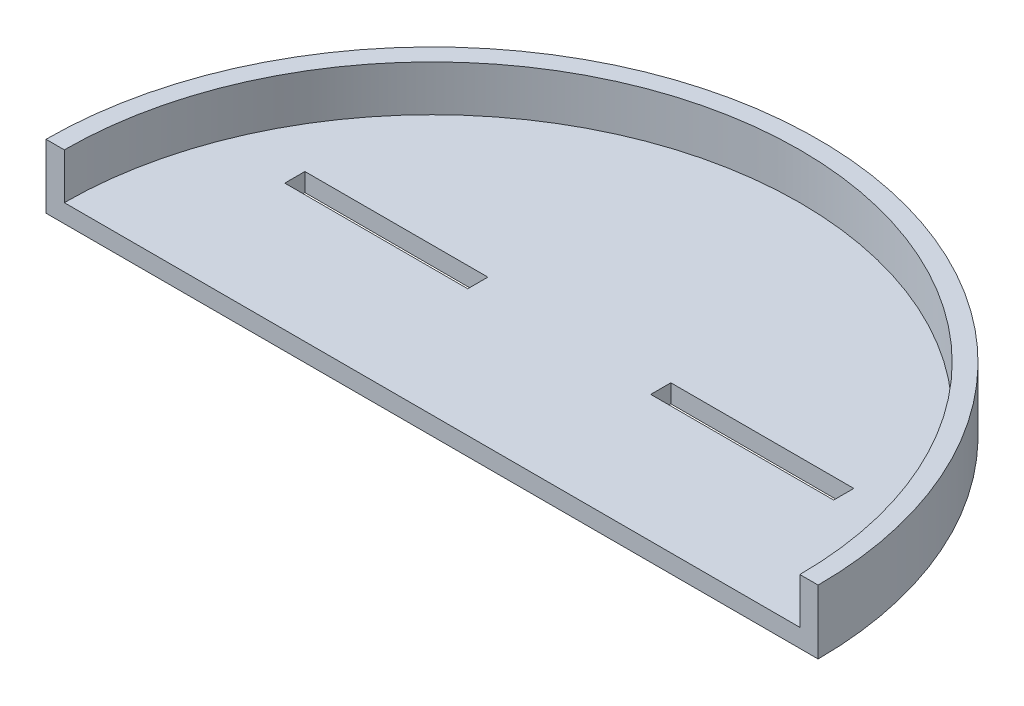
ISO-10303-21;
HEADER;
FILE_DESCRIPTION(('STEP AP214'),'2;1');
FILE_NAME('part.step','',(''),(''),'','','');
FILE_SCHEMA(('AUTOMOTIVE_DESIGN { 1 0 10303 214 1 1 1 1 }'));
ENDSEC;
DATA;
#1=APPLICATION_CONTEXT('core data for automotive mechanical design processes');
#2=APPLICATION_PROTOCOL_DEFINITION('international standard','automotive_design',2000,#1);
#3=PRODUCT_CONTEXT('',#1,'mechanical');
#4=PRODUCT('Part','Part','',(#3));
#5=PRODUCT_RELATED_PRODUCT_CATEGORY('part','',(#4));
#6=PRODUCT_DEFINITION_FORMATION('','',#4);
#7=PRODUCT_DEFINITION_CONTEXT('part definition',#1,'design');
#8=PRODUCT_DEFINITION('design','',#6,#7);
#9=PRODUCT_DEFINITION_SHAPE('','',#8);
#10=(LENGTH_UNIT() NAMED_UNIT(*) SI_UNIT(.MILLI.,.METRE.));
#11=(NAMED_UNIT(*) PLANE_ANGLE_UNIT() SI_UNIT($,.RADIAN.));
#12=(NAMED_UNIT(*) SI_UNIT($,.STERADIAN.) SOLID_ANGLE_UNIT());
#13=UNCERTAINTY_MEASURE_WITH_UNIT(LENGTH_MEASURE(1.E-05),#10,'distance_accuracy_value','');
#14=(GEOMETRIC_REPRESENTATION_CONTEXT(3) GLOBAL_UNCERTAINTY_ASSIGNED_CONTEXT((#13)) GLOBAL_UNIT_ASSIGNED_CONTEXT((#10,
#11,#12)) REPRESENTATION_CONTEXT('',''));
#15=CARTESIAN_POINT('',(0.,0.,0.));
#16=DIRECTION('',(0.,0.,1.));
#17=DIRECTION('',(1.,0.,0.));
#18=AXIS2_PLACEMENT_3D('',#15,#16,#17);
#19=CARTESIAN_POINT('',(0.,0.,0.));
#20=DIRECTION('',(0.,-1.,0.));
#21=DIRECTION('',(0.,0.,-1.));
#22=AXIS2_PLACEMENT_3D('',#19,#20,#21);
#23=PLANE('',#22);
#24=DIRECTION('',(1.,0.,0.));
#25=VECTOR('',#24,1.);
#26=CARTESIAN_POINT('',(0.,0.,-20.447));
#27=LINE('',#26,#25);
#28=CARTESIAN_POINT('',(12.7,0.,-20.447));
#29=VERTEX_POINT('',#28);
#30=CARTESIAN_POINT('',(38.1,0.,-20.447));
#31=VERTEX_POINT('',#30);
#32=EDGE_CURVE('E177',#29,#31,#27,.T.);
#33=ORIENTED_EDGE('',*,*,#32,.T.);
#34=DIRECTION('',(0.,0.,1.));
#35=VECTOR('',#34,1.);
#36=CARTESIAN_POINT('',(38.1,0.,0.));
#37=LINE('',#36,#35);
#38=CARTESIAN_POINT('',(38.1,0.,-17.653));
#39=VERTEX_POINT('',#38);
#40=EDGE_CURVE('E167',#31,#39,#37,.T.);
#41=ORIENTED_EDGE('',*,*,#40,.T.);
#42=DIRECTION('',(1.,0.,0.));
#43=VECTOR('',#42,1.);
#44=CARTESIAN_POINT('',(0.,0.,-17.653));
#45=LINE('',#44,#43);
#46=CARTESIAN_POINT('',(12.7,0.,-17.653));
#47=VERTEX_POINT('',#46);
#48=EDGE_CURVE('E171',#47,#39,#45,.T.);
#49=ORIENTED_EDGE('',*,*,#48,.F.);
#50=DIRECTION('',(0.,0.,1.));
#51=VECTOR('',#50,1.);
#52=CARTESIAN_POINT('',(12.7,0.,0.));
#53=LINE('',#52,#51);
#54=EDGE_CURVE('E174',#29,#47,#53,.T.);
#55=ORIENTED_EDGE('',*,*,#54,.F.);
#56=EDGE_LOOP('',(#33,#41,#49,#55));
#57=FACE_BOUND('',#56,.T.);
#58=CARTESIAN_POINT('',(0.,0.,0.));
#59=DIRECTION('',(0.,1.,0.));
#60=DIRECTION('',(0.,0.,1.));
#61=AXIS2_PLACEMENT_3D('',#58,#59,#60);
#62=CIRCLE('',#61,51.054);
#63=CARTESIAN_POINT('',(51.054,0.,0.));
#64=VERTEX_POINT('',#63);
#65=CARTESIAN_POINT('',(-51.054,0.,0.));
#66=VERTEX_POINT('',#65);
#67=EDGE_CURVE('E149',#64,#66,#62,.T.);
#68=ORIENTED_EDGE('',*,*,#67,.T.);
#69=DIRECTION('',(1.,0.,0.));
#70=VECTOR('',#69,1.);
#71=CARTESIAN_POINT('',(0.,0.,0.));
#72=LINE('',#71,#70);
#73=EDGE_CURVE('E52',#66,#64,#72,.T.);
#74=ORIENTED_EDGE('',*,*,#73,.T.);
#75=EDGE_LOOP('',(#68,#74));
#76=FACE_BOUND('',#75,.T.);
#77=DIRECTION('',(1.,0.,0.));
#78=VECTOR('',#77,1.);
#79=CARTESIAN_POINT('',(0.,0.,-20.447));
#80=LINE('',#79,#78);
#81=CARTESIAN_POINT('',(-38.1,0.,-20.447));
#82=VERTEX_POINT('',#81);
#83=CARTESIAN_POINT('',(-12.7,0.,-20.447));
#84=VERTEX_POINT('',#83);
#85=EDGE_CURVE('E60',#82,#84,#80,.T.);
#86=ORIENTED_EDGE('',*,*,#85,.T.);
#87=DIRECTION('',(0.,0.,1.));
#88=VECTOR('',#87,1.);
#89=CARTESIAN_POINT('',(-12.7,0.,0.));
#90=LINE('',#89,#88);
#91=CARTESIAN_POINT('',(-12.7,0.,-17.653));
#92=VERTEX_POINT('',#91);
#93=EDGE_CURVE('E196',#84,#92,#90,.T.);
#94=ORIENTED_EDGE('',*,*,#93,.T.);
#95=DIRECTION('',(1.,0.,0.));
#96=VECTOR('',#95,1.);
#97=CARTESIAN_POINT('',(0.,0.,-17.653));
#98=LINE('',#97,#96);
#99=CARTESIAN_POINT('',(-38.1,0.,-17.653));
#100=VERTEX_POINT('',#99);
#101=EDGE_CURVE('E200',#100,#92,#98,.T.);
#102=ORIENTED_EDGE('',*,*,#101,.F.);
#103=DIRECTION('',(0.,0.,1.));
#104=VECTOR('',#103,1.);
#105=CARTESIAN_POINT('',(-38.1,0.,0.));
#106=LINE('',#105,#104);
#107=EDGE_CURVE('E203',#82,#100,#106,.T.);
#108=ORIENTED_EDGE('',*,*,#107,.F.);
#109=EDGE_LOOP('',(#86,#94,#102,#108));
#110=FACE_BOUND('',#109,.T.);
#111=ADVANCED_FACE('F38',(#57,#76,#110),#23,.F.);
#112=CARTESIAN_POINT('',(0.,-2.54,0.));
#113=DIRECTION('',(0.,-1.,0.));
#114=DIRECTION('',(0.,0.,-1.));
#115=AXIS2_PLACEMENT_3D('',#112,#113,#114);
#116=PLANE('',#115);
#117=DIRECTION('',(1.,0.,0.));
#118=VECTOR('',#117,1.);
#119=CARTESIAN_POINT('',(0.,-2.54,0.));
#120=LINE('',#119,#118);
#121=CARTESIAN_POINT('',(-53.594,-2.54,0.));
#122=VERTEX_POINT('',#121);
#123=CARTESIAN_POINT('',(53.594,-2.54,0.));
#124=VERTEX_POINT('',#123);
#125=EDGE_CURVE('E217',#122,#124,#120,.T.);
#126=ORIENTED_EDGE('',*,*,#125,.F.);
#127=CARTESIAN_POINT('',(0.,-2.54,0.));
#128=DIRECTION('',(0.,-1.,0.));
#129=DIRECTION('',(0.,0.,-1.));
#130=AXIS2_PLACEMENT_3D('',#127,#128,#129);
#131=CIRCLE('',#130,53.594);
#132=EDGE_CURVE('E142',#122,#124,#131,.T.);
#133=ORIENTED_EDGE('',*,*,#132,.T.);
#134=EDGE_LOOP('',(#126,#133));
#135=FACE_BOUND('',#134,.T.);
#136=DIRECTION('',(0.,0.,1.));
#137=VECTOR('',#136,1.);
#138=CARTESIAN_POINT('',(38.1,-2.54,0.));
#139=LINE('',#138,#137);
#140=CARTESIAN_POINT('',(38.1,-2.54,-20.447));
#141=VERTEX_POINT('',#140);
#142=CARTESIAN_POINT('',(38.1,-2.54,-17.653));
#143=VERTEX_POINT('',#142);
#144=EDGE_CURVE('E160',#141,#143,#139,.T.);
#145=ORIENTED_EDGE('',*,*,#144,.F.);
#146=DIRECTION('',(1.,0.,0.));
#147=VECTOR('',#146,1.);
#148=CARTESIAN_POINT('',(0.,-2.54,-20.447));
#149=LINE('',#148,#147);
#150=CARTESIAN_POINT('',(12.7,-2.54,-20.447));
#151=VERTEX_POINT('',#150);
#152=EDGE_CURVE('E170',#151,#141,#149,.T.);
#153=ORIENTED_EDGE('',*,*,#152,.F.);
#154=DIRECTION('',(0.,0.,1.));
#155=VECTOR('',#154,1.);
#156=CARTESIAN_POINT('',(12.7,-2.54,0.));
#157=LINE('',#156,#155);
#158=CARTESIAN_POINT('',(12.7,-2.54,-17.653));
#159=VERTEX_POINT('',#158);
#160=EDGE_CURVE('E184',#151,#159,#157,.T.);
#161=ORIENTED_EDGE('',*,*,#160,.T.);
#162=DIRECTION('',(1.,0.,0.));
#163=VECTOR('',#162,1.);
#164=CARTESIAN_POINT('',(0.,-2.54,-17.653));
#165=LINE('',#164,#163);
#166=EDGE_CURVE('E181',#159,#143,#165,.T.);
#167=ORIENTED_EDGE('',*,*,#166,.T.);
#168=EDGE_LOOP('',(#145,#153,#161,#167));
#169=FACE_BOUND('',#168,.T.);
#170=DIRECTION('',(0.,0.,1.));
#171=VECTOR('',#170,1.);
#172=CARTESIAN_POINT('',(-12.7,-2.54,0.));
#173=LINE('',#172,#171);
#174=CARTESIAN_POINT('',(-12.7,-2.54,-20.447));
#175=VERTEX_POINT('',#174);
#176=CARTESIAN_POINT('',(-12.7,-2.54,-17.653));
#177=VERTEX_POINT('',#176);
#178=EDGE_CURVE('E191',#175,#177,#173,.T.);
#179=ORIENTED_EDGE('',*,*,#178,.F.);
#180=DIRECTION('',(1.,0.,0.));
#181=VECTOR('',#180,1.);
#182=CARTESIAN_POINT('',(0.,-2.54,-20.447));
#183=LINE('',#182,#181);
#184=CARTESIAN_POINT('',(-38.1,-2.54,-20.447));
#185=VERTEX_POINT('',#184);
#186=EDGE_CURVE('E199',#185,#175,#183,.T.);
#187=ORIENTED_EDGE('',*,*,#186,.F.);
#188=DIRECTION('',(0.,0.,1.));
#189=VECTOR('',#188,1.);
#190=CARTESIAN_POINT('',(-38.1,-2.54,0.));
#191=LINE('',#190,#189);
#192=CARTESIAN_POINT('',(-38.1,-2.54,-17.653));
#193=VERTEX_POINT('',#192);
#194=EDGE_CURVE('E211',#185,#193,#191,.T.);
#195=ORIENTED_EDGE('',*,*,#194,.T.);
#196=DIRECTION('',(1.,0.,0.));
#197=VECTOR('',#196,1.);
#198=CARTESIAN_POINT('',(0.,-2.54,-17.653));
#199=LINE('',#198,#197);
#200=EDGE_CURVE('E208',#193,#177,#199,.T.);
#201=ORIENTED_EDGE('',*,*,#200,.T.);
#202=EDGE_LOOP('',(#179,#187,#195,#201));
#203=FACE_BOUND('',#202,.T.);
#204=ADVANCED_FACE('F219',(#135,#169,#203),#116,.T.);
#205=CARTESIAN_POINT('',(0.,6.35,0.));
#206=DIRECTION('',(0.,1.,0.));
#207=DIRECTION('',(0.,0.,1.));
#208=AXIS2_PLACEMENT_3D('',#205,#206,#207);
#209=PLANE('',#208);
#210=DIRECTION('',(1.,0.,0.));
#211=VECTOR('',#210,1.);
#212=CARTESIAN_POINT('',(0.,6.35,0.));
#213=LINE('',#212,#211);
#214=CARTESIAN_POINT('',(51.054,6.35,0.));
#215=VERTEX_POINT('',#214);
#216=CARTESIAN_POINT('',(53.594,6.35,0.));
#217=VERTEX_POINT('',#216);
#218=EDGE_CURVE('E134',#215,#217,#213,.T.);
#219=ORIENTED_EDGE('',*,*,#218,.T.);
#220=CARTESIAN_POINT('',(0.,6.35,0.));
#221=DIRECTION('',(0.,1.,0.));
#222=DIRECTION('',(0.,0.,1.));
#223=AXIS2_PLACEMENT_3D('',#220,#221,#222);
#224=CIRCLE('',#223,53.594);
#225=CARTESIAN_POINT('',(-53.594,6.35,0.));
#226=VERTEX_POINT('',#225);
#227=EDGE_CURVE('E140',#217,#226,#224,.T.);
#228=ORIENTED_EDGE('',*,*,#227,.T.);
#229=CARTESIAN_POINT('',(-51.054,6.35,0.));
#230=VERTEX_POINT('',#229);
#231=EDGE_CURVE('E125',#226,#230,#213,.T.);
#232=ORIENTED_EDGE('',*,*,#231,.T.);
#233=CARTESIAN_POINT('',(0.,6.35,0.));
#234=DIRECTION('',(0.,1.,0.));
#235=DIRECTION('',(0.,0.,1.));
#236=AXIS2_PLACEMENT_3D('',#233,#234,#235);
#237=CIRCLE('',#236,51.054);
#238=EDGE_CURVE('E147',#215,#230,#237,.T.);
#239=ORIENTED_EDGE('',*,*,#238,.F.);
#240=EDGE_LOOP('',(#219,#228,#232,#239));
#241=FACE_BOUND('',#240,.T.);
#242=ADVANCED_FACE('F146',(#241),#209,.T.);
#243=CARTESIAN_POINT('',(0.,6.35,0.));
#244=DIRECTION('',(0.,-1.,0.));
#245=DIRECTION('',(0.,0.,-1.));
#246=AXIS2_PLACEMENT_3D('',#243,#244,#245);
#247=CYLINDRICAL_SURFACE('',#246,53.594);
#248=ORIENTED_EDGE('',*,*,#227,.F.);
#249=DIRECTION('',(0.,-1.,0.));
#250=VECTOR('',#249,1.);
#251=CARTESIAN_POINT('',(53.594,6.35,0.));
#252=LINE('',#251,#250);
#253=EDGE_CURVE('E143',#217,#124,#252,.T.);
#254=ORIENTED_EDGE('',*,*,#253,.T.);
#255=ORIENTED_EDGE('',*,*,#132,.F.);
#256=DIRECTION('',(0.,-1.,0.));
#257=VECTOR('',#256,1.);
#258=CARTESIAN_POINT('',(-53.594,6.35,0.));
#259=LINE('',#258,#257);
#260=EDGE_CURVE('E128',#122,#226,#259,.F.);
#261=ORIENTED_EDGE('',*,*,#260,.T.);
#262=EDGE_LOOP('',(#248,#254,#255,#261));
#263=FACE_BOUND('',#262,.T.);
#264=ADVANCED_FACE('F40',(#263),#247,.T.);
#265=CARTESIAN_POINT('',(0.,6.35,0.));
#266=DIRECTION('',(0.,-1.,0.));
#267=DIRECTION('',(0.,0.,-1.));
#268=AXIS2_PLACEMENT_3D('',#265,#266,#267);
#269=CYLINDRICAL_SURFACE('',#268,51.054);
#270=DIRECTION('',(0.,-1.,0.));
#271=VECTOR('',#270,1.);
#272=CARTESIAN_POINT('',(51.054,6.35,0.));
#273=LINE('',#272,#271);
#274=EDGE_CURVE('E11',#215,#64,#273,.T.);
#275=ORIENTED_EDGE('',*,*,#274,.F.);
#276=ORIENTED_EDGE('',*,*,#238,.T.);
#277=DIRECTION('',(0.,-1.,0.));
#278=VECTOR('',#277,1.);
#279=CARTESIAN_POINT('',(-51.054,6.35,0.));
#280=LINE('',#279,#278);
#281=EDGE_CURVE('E46',#66,#230,#280,.F.);
#282=ORIENTED_EDGE('',*,*,#281,.F.);
#283=ORIENTED_EDGE('',*,*,#67,.F.);
#284=EDGE_LOOP('',(#275,#276,#282,#283));
#285=FACE_BOUND('',#284,.T.);
#286=ADVANCED_FACE('F259',(#285),#269,.F.);
#287=CARTESIAN_POINT('',(0.,-2.54,-20.447));
#288=DIRECTION('',(0.,0.,1.));
#289=DIRECTION('',(1.,0.,0.));
#290=AXIS2_PLACEMENT_3D('',#287,#288,#289);
#291=PLANE('',#290);
#292=ORIENTED_EDGE('',*,*,#32,.F.);
#293=DIRECTION('',(0.,1.,0.));
#294=VECTOR('',#293,1.);
#295=CARTESIAN_POINT('',(12.7,-2.54,-20.447));
#296=LINE('',#295,#294);
#297=EDGE_CURVE('E156',#151,#29,#296,.T.);
#298=ORIENTED_EDGE('',*,*,#297,.F.);
#299=ORIENTED_EDGE('',*,*,#152,.T.);
#300=DIRECTION('',(0.,1.,0.));
#301=VECTOR('',#300,1.);
#302=CARTESIAN_POINT('',(38.1,-2.54,-20.447));
#303=LINE('',#302,#301);
#304=EDGE_CURVE('E164',#141,#31,#303,.T.);
#305=ORIENTED_EDGE('',*,*,#304,.T.);
#306=EDGE_LOOP('',(#292,#298,#299,#305));
#307=FACE_BOUND('',#306,.T.);
#308=ADVANCED_FACE('F261',(#307),#291,.T.);
#309=CARTESIAN_POINT('',(38.1,-2.54,0.));
#310=DIRECTION('',(-1.,0.,0.));
#311=DIRECTION('',(0.,0.,1.));
#312=AXIS2_PLACEMENT_3D('',#309,#310,#311);
#313=PLANE('',#312);
#314=ORIENTED_EDGE('',*,*,#40,.F.);
#315=ORIENTED_EDGE('',*,*,#304,.F.);
#316=ORIENTED_EDGE('',*,*,#144,.T.);
#317=DIRECTION('',(0.,1.,0.));
#318=VECTOR('',#317,1.);
#319=CARTESIAN_POINT('',(38.1,-2.54,-17.653));
#320=LINE('',#319,#318);
#321=EDGE_CURVE('E162',#143,#39,#320,.T.);
#322=ORIENTED_EDGE('',*,*,#321,.T.);
#323=EDGE_LOOP('',(#314,#315,#316,#322));
#324=FACE_BOUND('',#323,.T.);
#325=ADVANCED_FACE('F333',(#324),#313,.T.);
#326=CARTESIAN_POINT('',(0.,-2.54,-17.653));
#327=DIRECTION('',(0.,0.,1.));
#328=DIRECTION('',(1.,0.,0.));
#329=AXIS2_PLACEMENT_3D('',#326,#327,#328);
#330=PLANE('',#329);
#331=ORIENTED_EDGE('',*,*,#48,.T.);
#332=ORIENTED_EDGE('',*,*,#321,.F.);
#333=ORIENTED_EDGE('',*,*,#166,.F.);
#334=DIRECTION('',(0.,1.,0.));
#335=VECTOR('',#334,1.);
#336=CARTESIAN_POINT('',(12.7,-2.54,-17.653));
#337=LINE('',#336,#335);
#338=EDGE_CURVE('E159',#159,#47,#337,.T.);
#339=ORIENTED_EDGE('',*,*,#338,.T.);
#340=EDGE_LOOP('',(#331,#332,#333,#339));
#341=FACE_BOUND('',#340,.T.);
#342=ADVANCED_FACE('F322',(#341),#330,.F.);
#343=CARTESIAN_POINT('',(12.7,-2.54,0.));
#344=DIRECTION('',(-1.,0.,0.));
#345=DIRECTION('',(0.,0.,1.));
#346=AXIS2_PLACEMENT_3D('',#343,#344,#345);
#347=PLANE('',#346);
#348=ORIENTED_EDGE('',*,*,#54,.T.);
#349=ORIENTED_EDGE('',*,*,#338,.F.);
#350=ORIENTED_EDGE('',*,*,#160,.F.);
#351=ORIENTED_EDGE('',*,*,#297,.T.);
#352=EDGE_LOOP('',(#348,#349,#350,#351));
#353=FACE_BOUND('',#352,.T.);
#354=ADVANCED_FACE('F313',(#353),#347,.F.);
#355=CARTESIAN_POINT('',(0.,-2.54,-20.447));
#356=DIRECTION('',(0.,0.,1.));
#357=DIRECTION('',(1.,0.,0.));
#358=AXIS2_PLACEMENT_3D('',#355,#356,#357);
#359=PLANE('',#358);
#360=ORIENTED_EDGE('',*,*,#85,.F.);
#361=DIRECTION('',(0.,1.,0.));
#362=VECTOR('',#361,1.);
#363=CARTESIAN_POINT('',(-38.1,-2.54,-20.447));
#364=LINE('',#363,#362);
#365=EDGE_CURVE('E188',#185,#82,#364,.T.);
#366=ORIENTED_EDGE('',*,*,#365,.F.);
#367=ORIENTED_EDGE('',*,*,#186,.T.);
#368=DIRECTION('',(0.,1.,0.));
#369=VECTOR('',#368,1.);
#370=CARTESIAN_POINT('',(-12.7,-2.54,-20.447));
#371=LINE('',#370,#369);
#372=EDGE_CURVE('E155',#175,#84,#371,.T.);
#373=ORIENTED_EDGE('',*,*,#372,.T.);
#374=EDGE_LOOP('',(#360,#366,#367,#373));
#375=FACE_BOUND('',#374,.T.);
#376=ADVANCED_FACE('F238',(#375),#359,.T.);
#377=CARTESIAN_POINT('',(-12.7,-2.54,0.));
#378=DIRECTION('',(-1.,0.,0.));
#379=DIRECTION('',(0.,0.,1.));
#380=AXIS2_PLACEMENT_3D('',#377,#378,#379);
#381=PLANE('',#380);
#382=ORIENTED_EDGE('',*,*,#93,.F.);
#383=ORIENTED_EDGE('',*,*,#372,.F.);
#384=ORIENTED_EDGE('',*,*,#178,.T.);
#385=DIRECTION('',(0.,1.,0.));
#386=VECTOR('',#385,1.);
#387=CARTESIAN_POINT('',(-12.7,-2.54,-17.653));
#388=LINE('',#387,#386);
#389=EDGE_CURVE('E193',#177,#92,#388,.T.);
#390=ORIENTED_EDGE('',*,*,#389,.T.);
#391=EDGE_LOOP('',(#382,#383,#384,#390));
#392=FACE_BOUND('',#391,.T.);
#393=ADVANCED_FACE('F231',(#392),#381,.T.);
#394=CARTESIAN_POINT('',(0.,-2.54,-17.653));
#395=DIRECTION('',(0.,0.,1.));
#396=DIRECTION('',(1.,0.,0.));
#397=AXIS2_PLACEMENT_3D('',#394,#395,#396);
#398=PLANE('',#397);
#399=ORIENTED_EDGE('',*,*,#101,.T.);
#400=ORIENTED_EDGE('',*,*,#389,.F.);
#401=ORIENTED_EDGE('',*,*,#200,.F.);
#402=DIRECTION('',(0.,1.,0.));
#403=VECTOR('',#402,1.);
#404=CARTESIAN_POINT('',(-38.1,-2.54,-17.653));
#405=LINE('',#404,#403);
#406=EDGE_CURVE('E190',#193,#100,#405,.T.);
#407=ORIENTED_EDGE('',*,*,#406,.T.);
#408=EDGE_LOOP('',(#399,#400,#401,#407));
#409=FACE_BOUND('',#408,.T.);
#410=ADVANCED_FACE('F233',(#409),#398,.F.);
#411=CARTESIAN_POINT('',(-38.1,-2.54,0.));
#412=DIRECTION('',(-1.,0.,0.));
#413=DIRECTION('',(0.,0.,1.));
#414=AXIS2_PLACEMENT_3D('',#411,#412,#413);
#415=PLANE('',#414);
#416=ORIENTED_EDGE('',*,*,#107,.T.);
#417=ORIENTED_EDGE('',*,*,#406,.F.);
#418=ORIENTED_EDGE('',*,*,#194,.F.);
#419=ORIENTED_EDGE('',*,*,#365,.T.);
#420=EDGE_LOOP('',(#416,#417,#418,#419));
#421=FACE_BOUND('',#420,.T.);
#422=ADVANCED_FACE('F241',(#421),#415,.F.);
#423=CARTESIAN_POINT('',(0.,6.35,0.));
#424=DIRECTION('',(0.,0.,-1.));
#425=DIRECTION('',(-1.,0.,0.));
#426=AXIS2_PLACEMENT_3D('',#423,#424,#425);
#427=PLANE('',#426);
#428=ORIENTED_EDGE('',*,*,#218,.F.);
#429=ORIENTED_EDGE('',*,*,#274,.T.);
#430=ORIENTED_EDGE('',*,*,#73,.F.);
#431=ORIENTED_EDGE('',*,*,#281,.T.);
#432=ORIENTED_EDGE('',*,*,#231,.F.);
#433=ORIENTED_EDGE('',*,*,#260,.F.);
#434=ORIENTED_EDGE('',*,*,#125,.T.);
#435=ORIENTED_EDGE('',*,*,#253,.F.);
#436=EDGE_LOOP('',(#428,#429,#430,#431,#432,#433,#434,#435));
#437=FACE_BOUND('',#436,.T.);
#438=ADVANCED_FACE('F127',(#437),#427,.F.);
#439=CLOSED_SHELL('',(#111,#204,#242,#264,#286,#308,#325,#342,#354,#376,#393,#410,#422,#438));
#440=MANIFOLD_SOLID_BREP('B2',#439);
#441=ADVANCED_BREP_SHAPE_REPRESENTATION('',(#18,#440),#14);
#442=SHAPE_DEFINITION_REPRESENTATION(#9,#441);
ENDSEC;
END-ISO-10303-21;
